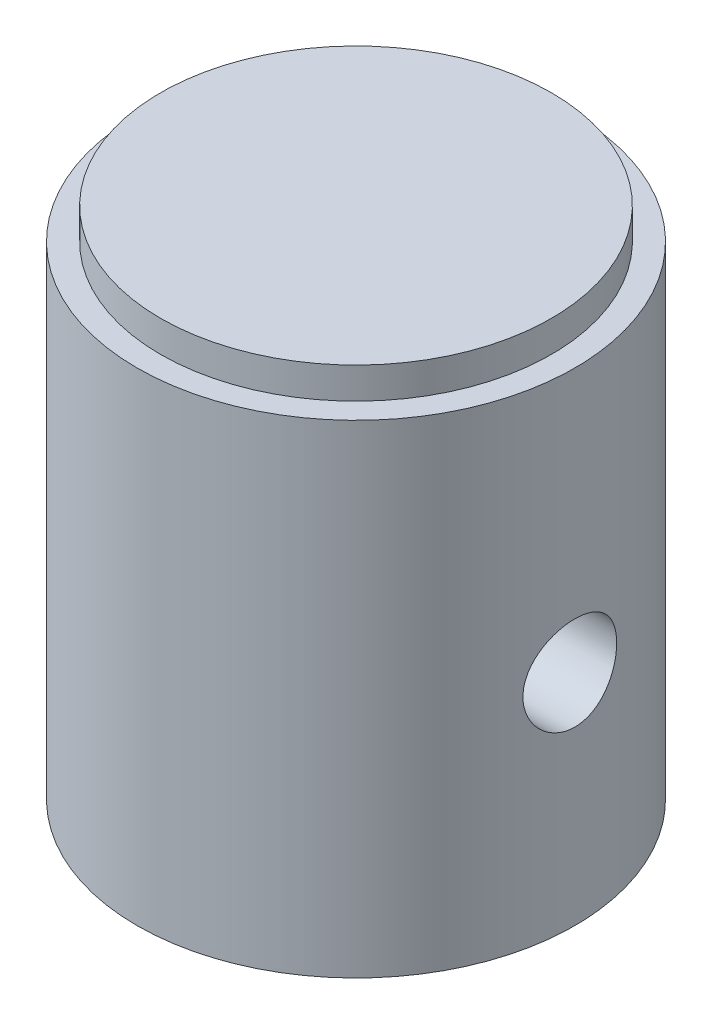
ISO-10303-21;
HEADER;
FILE_DESCRIPTION(('STEP AP214'),'2;1');
FILE_NAME('part.step','',(''),(''),'','','');
FILE_SCHEMA(('AUTOMOTIVE_DESIGN { 1 0 10303 214 1 1 1 1 }'));
ENDSEC;
DATA;
#1=APPLICATION_CONTEXT('core data for automotive mechanical design processes');
#2=APPLICATION_PROTOCOL_DEFINITION('international standard','automotive_design',2000,#1);
#3=PRODUCT_CONTEXT('',#1,'mechanical');
#4=PRODUCT('Part','Part','',(#3));
#5=PRODUCT_RELATED_PRODUCT_CATEGORY('part','',(#4));
#6=PRODUCT_DEFINITION_FORMATION('','',#4);
#7=PRODUCT_DEFINITION_CONTEXT('part definition',#1,'design');
#8=PRODUCT_DEFINITION('design','',#6,#7);
#9=PRODUCT_DEFINITION_SHAPE('','',#8);
#10=(LENGTH_UNIT() NAMED_UNIT(*) SI_UNIT(.MILLI.,.METRE.));
#11=(NAMED_UNIT(*) PLANE_ANGLE_UNIT() SI_UNIT($,.RADIAN.));
#12=(NAMED_UNIT(*) SI_UNIT($,.STERADIAN.) SOLID_ANGLE_UNIT());
#13=UNCERTAINTY_MEASURE_WITH_UNIT(LENGTH_MEASURE(1.E-05),#10,'distance_accuracy_value','');
#14=(GEOMETRIC_REPRESENTATION_CONTEXT(3) GLOBAL_UNCERTAINTY_ASSIGNED_CONTEXT((#13)) GLOBAL_UNIT_ASSIGNED_CONTEXT((#10,
#11,#12)) REPRESENTATION_CONTEXT('',''));
#15=CARTESIAN_POINT('',(0.,0.,0.));
#16=DIRECTION('',(0.,0.,1.));
#17=DIRECTION('',(1.,0.,0.));
#18=AXIS2_PLACEMENT_3D('',#15,#16,#17);
#19=CARTESIAN_POINT('',(0.,0.,0.));
#20=DIRECTION('',(0.,1.,0.));
#21=DIRECTION('',(0.,0.,1.));
#22=AXIS2_PLACEMENT_3D('',#19,#20,#21);
#23=PLANE('',#22);
#24=CARTESIAN_POINT('',(0.,0.,0.));
#25=DIRECTION('',(0.,1.,0.));
#26=DIRECTION('',(0.,0.,1.));
#27=AXIS2_PLACEMENT_3D('',#24,#25,#26);
#28=CIRCLE('',#27,6.25);
#29=CARTESIAN_POINT('',(0.,0.,6.25));
#30=VERTEX_POINT('',#29);
#31=EDGE_CURVE('E11',#30,#30,#28,.T.);
#32=ORIENTED_EDGE('',*,*,#31,.T.);
#33=EDGE_LOOP('',(#32));
#34=FACE_BOUND('',#33,.T.);
#35=ADVANCED_FACE('F43',(#34),#23,.T.);
#36=CARTESIAN_POINT('',(0.,0.,0.));
#37=DIRECTION('',(0.,1.,0.));
#38=DIRECTION('',(0.,0.,1.));
#39=AXIS2_PLACEMENT_3D('',#36,#37,#38);
#40=CYLINDRICAL_SURFACE('',#39,6.25);
#41=CARTESIAN_POINT('',(0.,-1.,0.));
#42=DIRECTION('',(0.,1.,0.));
#43=DIRECTION('',(0.,0.,1.));
#44=AXIS2_PLACEMENT_3D('',#41,#42,#43);
#45=CIRCLE('',#44,6.25);
#46=CARTESIAN_POINT('',(0.,-1.,6.25));
#47=VERTEX_POINT('',#46);
#48=EDGE_CURVE('E56',#47,#47,#45,.T.);
#49=ORIENTED_EDGE('',*,*,#48,.T.);
#50=EDGE_LOOP('',(#49));
#51=FACE_BOUND('',#50,.T.);
#52=ORIENTED_EDGE('',*,*,#31,.F.);
#53=EDGE_LOOP('',(#52));
#54=FACE_BOUND('',#53,.T.);
#55=ADVANCED_FACE('F131',(#51,#54),#40,.T.);
#56=CARTESIAN_POINT('',(-6.25,-1.,0.));
#57=DIRECTION('',(0.,1.,0.));
#58=DIRECTION('',(0.,0.,1.));
#59=AXIS2_PLACEMENT_3D('',#56,#57,#58);
#60=PLANE('',#59);
#61=CARTESIAN_POINT('',(0.,-1.,0.));
#62=DIRECTION('',(0.,1.,0.));
#63=DIRECTION('',(0.,0.,1.));
#64=AXIS2_PLACEMENT_3D('',#61,#62,#63);
#65=CIRCLE('',#64,7.);
#66=CARTESIAN_POINT('',(0.,-1.,7.));
#67=VERTEX_POINT('',#66);
#68=EDGE_CURVE('E95',#67,#67,#65,.T.);
#69=ORIENTED_EDGE('',*,*,#68,.T.);
#70=EDGE_LOOP('',(#69));
#71=FACE_BOUND('',#70,.T.);
#72=ORIENTED_EDGE('',*,*,#48,.F.);
#73=EDGE_LOOP('',(#72));
#74=FACE_BOUND('',#73,.T.);
#75=ADVANCED_FACE('F127',(#71,#74),#60,.T.);
#76=CARTESIAN_POINT('',(0.,0.,0.));
#77=DIRECTION('',(0.,1.,0.));
#78=DIRECTION('',(0.,0.,1.));
#79=AXIS2_PLACEMENT_3D('',#76,#77,#78);
#80=CYLINDRICAL_SURFACE('',#79,7.);
#81=CARTESIAN_POINT('',(-7.,-7.94610214924503,0.));
#82=CARTESIAN_POINT('',(-6.99999846043226,-7.94610504881934,-0.0832358860906165));
#83=CARTESIAN_POINT('',(-6.9985002594971,-7.95305375763289,-0.166507195600274));
#84=CARTESIAN_POINT('',(-6.99266829827727,-7.98063780609863,-0.330687344293327));
#85=CARTESIAN_POINT('',(-6.98833245637099,-8.00128319343997,-0.41159440357119));
#86=CARTESIAN_POINT('',(-6.97730831788826,-8.05558651385307,-0.568649323817737));
#87=CARTESIAN_POINT('',(-6.97062242967171,-8.08923112862635,-0.644801963446556));
#88=CARTESIAN_POINT('',(-6.95562106817971,-8.1685362354163,-0.790378177960787));
#89=CARTESIAN_POINT('',(-6.9473056503666,-8.21419631849498,-0.859801981747369));
#90=CARTESIAN_POINT('',(-6.92981369246311,-8.31698244891854,-0.991024790535229));
#91=CARTESIAN_POINT('',(-6.92062683143259,-8.37425837114356,-1.05270503419445));
#92=CARTESIAN_POINT('',(-6.90250069814144,-8.49832846493023,-1.16566042389435));
#93=CARTESIAN_POINT('',(-6.8935614473163,-8.56512345749629,-1.21693467150908));
#94=CARTESIAN_POINT('',(-6.87684116047225,-8.70720790210547,-1.30814204379808));
#95=CARTESIAN_POINT('',(-6.8690733634436,-8.78257966700124,-1.34794958335009));
#96=CARTESIAN_POINT('',(-6.85572325558537,-8.93913660301187,-1.41428823691148));
#97=CARTESIAN_POINT('',(-6.85014069470711,-9.02032110773761,-1.44082087001716));
#98=CARTESIAN_POINT('',(-6.8418980892631,-9.18491323583311,-1.47946574422454));
#99=CARTESIAN_POINT('',(-6.83919556896486,-9.2682694249089,-1.49178779748342));
#100=CARTESIAN_POINT('',(-6.83689139845106,-9.43590638175203,-1.50231395206577));
#101=CARTESIAN_POINT('',(-6.83728938291729,-9.52018703942498,-1.50051971664629));
#102=CARTESIAN_POINT('',(-6.84110276603832,-9.68572683717883,-1.48303326340861));
#103=CARTESIAN_POINT('',(-6.84446541682162,-9.76701303834519,-1.46758398649408));
#104=CARTESIAN_POINT('',(-6.85374593375788,-9.92581238953438,-1.42361054298677));
#105=CARTESIAN_POINT('',(-6.85966393808402,-10.0033253352774,-1.39508566936466));
#106=CARTESIAN_POINT('',(-6.87344080755724,-10.1530650221184,-1.32554551075991));
#107=CARTESIAN_POINT('',(-6.88131420983365,-10.2252466619576,-1.2844361097283));
#108=CARTESIAN_POINT('',(-6.89810572501288,-10.361777314203,-1.19096007283993));
#109=CARTESIAN_POINT('',(-6.90702397481896,-10.4261252979312,-1.13859196103562));
#110=CARTESIAN_POINT('',(-6.92512718393878,-10.5465615049184,-1.0227954275532));
#111=CARTESIAN_POINT('',(-6.93431383972177,-10.6024508558298,-0.959160233964412));
#112=CARTESIAN_POINT('',(-6.95175017497059,-10.7027958829347,-0.823317306269098));
#113=CARTESIAN_POINT('',(-6.95999983875972,-10.7472513678454,-0.751109428775401));
#114=CARTESIAN_POINT('',(-6.97465778534003,-10.823512829152,-0.59993346204996));
#115=CARTESIAN_POINT('',(-6.98106238643354,-10.855293561823,-0.520952258863484));
#116=CARTESIAN_POINT('',(-6.99128109245334,-10.9050777975661,-0.358603146685707));
#117=CARTESIAN_POINT('',(-6.99509555860384,-10.9230832218083,-0.27523585113367));
#118=CARTESIAN_POINT('',(-6.99965306347808,-10.9445183633885,-0.10818767083663));
#119=CARTESIAN_POINT('',(-7.00045336521066,-10.9482198621268,-0.0245431772716159));
#120=CARTESIAN_POINT('',(-6.99905248935969,-10.9416775781199,0.142168973650404));
#121=CARTESIAN_POINT('',(-6.99685150675698,-10.9314347012821,0.225236668127254));
#122=CARTESIAN_POINT('',(-6.98973143045266,-10.8975199055833,0.387542537982805));
#123=CARTESIAN_POINT('',(-6.98484105045459,-10.8739897797725,0.466811712908477));
#124=CARTESIAN_POINT('',(-6.9728892442151,-10.8143252062502,0.620278450473417));
#125=CARTESIAN_POINT('',(-6.96582763822237,-10.7781897149334,0.694475592587739));
#126=CARTESIAN_POINT('',(-6.950175043904,-10.6937686061847,0.836821397964753));
#127=CARTESIAN_POINT('',(-6.94156431354275,-10.6453223543353,0.90487257511114));
#128=CARTESIAN_POINT('',(-6.92381033034847,-10.5378673243563,1.0319769255236));
#129=CARTESIAN_POINT('',(-6.91466701142097,-10.4788572333576,1.091028978692));
#130=CARTESIAN_POINT('',(-6.89668172706324,-10.3507047790579,1.19952711057989));
#131=CARTESIAN_POINT('',(-6.88784792221285,-10.2814020500229,1.24878537255157));
#132=CARTESIAN_POINT('',(-6.87166654559681,-10.135347552767,1.3349641538604));
#133=CARTESIAN_POINT('',(-6.86431891048055,-10.0585961022675,1.37188519913706));
#134=CARTESIAN_POINT('',(-6.8520100980739,-9.90022985025043,1.43209741248548));
#135=CARTESIAN_POINT('',(-6.84703574582967,-9.81864479281437,1.45546398641275));
#136=CARTESIAN_POINT('',(-6.84001186708418,-9.6525865654114,1.48812696085335));
#137=CARTESIAN_POINT('',(-6.83796189439706,-9.56811383804371,1.49742550780258));
#138=CARTESIAN_POINT('',(-6.83704618848155,-9.40056980606979,1.5015999992604));
#139=CARTESIAN_POINT('',(-6.83811476518543,-9.31750613426446,1.49677347258311));
#140=CARTESIAN_POINT('',(-6.8431676318483,-9.15340490711245,1.47349789406331));
#141=CARTESIAN_POINT('',(-6.84715189026714,-9.07236732985846,1.45504898957979));
#142=CARTESIAN_POINT('',(-6.85755581104157,-8.91484349137587,1.40519345940434));
#143=CARTESIAN_POINT('',(-6.86396764224703,-8.83834350058074,1.37382847170887));
#144=CARTESIAN_POINT('',(-6.87850764590649,-8.69164677673819,1.29906751595601));
#145=CARTESIAN_POINT('',(-6.88663598880362,-8.62145067062999,1.255670353015));
#146=CARTESIAN_POINT('',(-6.90389055593232,-8.48788395551967,1.15708290349304));
#147=CARTESIAN_POINT('',(-6.91303309938926,-8.42467245329806,1.10167987421237));
#148=CARTESIAN_POINT('',(-6.93117449799694,-8.30834588672458,0.981086554619622));
#149=CARTESIAN_POINT('',(-6.94017331951296,-8.25523315493283,0.915894009385597));
#150=CARTESIAN_POINT('',(-6.95714491048987,-8.15998618973947,0.776603147268717));
#151=CARTESIAN_POINT('',(-6.96510364570626,-8.11799554301406,0.702404846009641));
#152=CARTESIAN_POINT('',(-6.97895826104019,-8.04714762033885,0.547850160940599));
#153=CARTESIAN_POINT('',(-6.98485590212343,-8.01827912666,0.46749910586388));
#154=CARTESIAN_POINT('',(-6.99284848461772,-7.97974996411389,0.322535217553205));
#155=CARTESIAN_POINT('',(-6.99551391888263,-7.967155715265,0.25871720554598));
#156=CARTESIAN_POINT('',(-6.99909024154719,-7.95033084753337,0.129939960853847));
#157=CARTESIAN_POINT('',(-7.00000120191314,-7.94609988559897,0.0649807750887452));
#158=CARTESIAN_POINT('',(-7.,-7.94610214924503,0.));
#159=B_SPLINE_CURVE_WITH_KNOTS('',3,(#81,#82,#83,#84,#85,#86,#87,#88,#89,#90,#91,#92,#93,#94,
#95,#96,#97,#98,#99,#100,#101,#102,#103,#104,#105,#106,#107,#108,#109,#110,#111,#112,#113,#114,
#115,#116,#117,#118,#119,#120,#121,#122,#123,#124,#125,#126,#127,#128,#129,#130,#131,#132,#133,
#134,#135,#136,#137,#138,#139,#140,#141,#142,#143,#144,#145,#146,#147,#148,#149,#150,#151,#152,
#153,#154,#155,#156,#157,#158),.UNSPECIFIED.,.T.,.F.,(4,2,2,2,2,2,2,2,2,2,2,2,2,2,2,2,2,2,2,2,2,
2,2,2,2,2,2,2,2,2,2,2,2,2,2,2,2,2,4),(0.,0.249469836512082,0.499122883219935,0.748520824425602,
0.997910278645886,1.25074961881732,1.50361077918506,1.7591442921451,2.0146485567749,
2.26633008124666,2.51798195169165,2.76524475452928,3.01252092904568,3.26169356165968,
3.51089887920889,3.76527011050291,4.0196455970235,4.27452521139806,4.52936927256343,
4.77934665704185,5.02930780231429,5.27665060589267,5.52401389198434,5.77478733867803,
6.02559197304485,6.28082063283534,6.53603841075806,6.78982240408475,7.04356767229185,
7.29200680540294,7.5404432510827,7.78808499706785,8.03575134451623,8.28822950154114,
8.54076590397115,8.79641910357222,9.05185334010271,9.24661799132294,9.44137465337336),.UNSPECIFIED.);
#160=CARTESIAN_POINT('',(-7.,-7.94610214924503,0.));
#161=VERTEX_POINT('',#160);
#162=EDGE_CURVE('E72',#161,#161,#159,.T.);
#163=ORIENTED_EDGE('',*,*,#162,.F.);
#164=EDGE_LOOP('',(#163));
#165=FACE_BOUND('',#164,.T.);
#166=CARTESIAN_POINT('',(6.83739716558867,-9.44610214924503,-1.5));
#167=CARTESIAN_POINT('',(6.83739884558951,-9.36289099676308,-1.49999708238613));
#168=CARTESIAN_POINT('',(6.83893272341929,-9.27964437530291,-1.49305236244768));
#169=CARTESIAN_POINT('',(6.84489178429867,-9.11551547700303,-1.46548559252999));
#170=CARTESIAN_POINT('',(6.84931911211841,-9.03463500056883,-1.44485339653622));
#171=CARTESIAN_POINT('',(6.86054115293409,-8.87763639967083,-1.39058863684599));
#172=CARTESIAN_POINT('',(6.86733332725825,-8.80151327112357,-1.35697000991314));
#173=CARTESIAN_POINT('',(6.88251670848644,-8.65598687530042,-1.27772617673341));
#174=CARTESIAN_POINT('',(6.89090786877545,-8.58658341221596,-1.23210132048776));
#175=CARTESIAN_POINT('',(6.90849578796654,-8.45533918776291,-1.12935142570221));
#176=CARTESIAN_POINT('',(6.91770249871753,-8.39362327300507,-1.07206859483983));
#177=CARTESIAN_POINT('',(6.93579691710397,-8.28059859483925,-0.947969508129577));
#178=CARTESIAN_POINT('',(6.94468460051416,-8.22929062038497,-0.881152530217675));
#179=CARTESIAN_POINT('',(6.96124769109432,-8.1380467047536,-0.739047288464581));
#180=CARTESIAN_POINT('',(6.96890998819429,-8.09823049347442,-0.663680488229954));
#181=CARTESIAN_POINT('',(6.98204671042933,-8.03187445779874,-0.507134269342596));
#182=CARTESIAN_POINT('',(6.98752137103329,-8.00533320445876,-0.425955477380312));
#183=CARTESIAN_POINT('',(6.9955956528118,-7.96667217831369,-0.261387187671512));
#184=CARTESIAN_POINT('',(6.99823733378385,-7.9543412206926,-0.178049400596924));
#185=CARTESIAN_POINT('',(7.00049362207002,-7.94379087193178,-0.0104489453066451));
#186=CARTESIAN_POINT('',(7.00010856232698,-7.94556992868428,0.073813620164759));
#187=CARTESIAN_POINT('',(6.99638700862558,-7.96303111390862,0.239417029250512));
#188=CARTESIAN_POINT('',(6.99309883152432,-7.97848564953496,0.320783115362112));
#189=CARTESIAN_POINT('',(6.98399541589104,-8.0224968310969,0.479739463978389));
#190=CARTESIAN_POINT('',(6.97818006616518,-8.05105405354477,0.557329560175054));
#191=CARTESIAN_POINT('',(6.96459754646858,-8.12066360813355,0.707167497556553));
#192=CARTESIAN_POINT('',(6.95681685803946,-8.16180291644938,0.779373657015788));
#193=CARTESIAN_POINT('',(6.94015793743865,-8.25534411740863,0.915940926562846));
#194=CARTESIAN_POINT('',(6.93127956144693,-8.30774748654534,0.980301006451528));
#195=CARTESIAN_POINT('',(6.91319326460925,-8.4235706937729,1.10070208800198));
#196=CARTESIAN_POINT('',(6.90398230372853,-8.48718972860207,1.1565511732025));
#197=CARTESIAN_POINT('',(6.88643566831974,-8.62298543431354,1.25682243234728));
#198=CARTESIAN_POINT('',(6.87810001563386,-8.69516231865028,1.30124432118068));
#199=CARTESIAN_POINT('',(6.86324023586723,-8.84632665030879,1.37748077573296));
#200=CARTESIAN_POINT('',(6.85672115127775,-8.92533227309747,1.40926035088923));
#201=CARTESIAN_POINT('',(6.84630340806616,-9.08773491519147,1.45903495159115));
#202=CARTESIAN_POINT('',(6.84240435218483,-9.17113126668822,1.47703206694628));
#203=CARTESIAN_POINT('',(6.83774881255446,-9.33819790189475,1.49843586024652));
#204=CARTESIAN_POINT('',(6.83693227051701,-9.42183082432234,1.5021214192864));
#205=CARTESIAN_POINT('',(6.83837239573993,-9.58851614242673,1.49555139642373));
#206=CARTESIAN_POINT('',(6.84062886101063,-9.67156857589858,1.48529673081635));
#207=CARTESIAN_POINT('',(6.84790415484205,-9.8337725842258,1.45137894635584));
#208=CARTESIAN_POINT('',(6.85289155274364,-9.91295758184199,1.42786830251553));
#209=CARTESIAN_POINT('',(6.86503859869777,-10.066264486778,1.3682705294675));
#210=CARTESIAN_POINT('',(6.87219844772849,-10.1403859248792,1.33218223662818));
#211=CARTESIAN_POINT('',(6.88801634080345,-10.282671834004,1.24783504416705));
#212=CARTESIAN_POINT('',(6.89669501746317,-10.3507317312572,1.19940368590792));
#213=CARTESIAN_POINT('',(6.91451775360139,-10.4778604951188,1.09197183833601));
#214=CARTESIAN_POINT('',(6.92366186834461,-10.5369282906935,1.03297009182161));
#215=CARTESIAN_POINT('',(6.94158239990173,-10.6454724521898,0.904812764420815));
#216=CARTESIAN_POINT('',(6.95034935607746,-10.694759065402,0.835494925828771));
#217=CARTESIAN_POINT('',(6.96635610714901,-10.7809875585961,0.689401481282276));
#218=CARTESIAN_POINT('',(6.97359597176692,-10.8179300022179,0.612626216043739));
#219=CARTESIAN_POINT('',(6.98569278381574,-10.8781542038835,0.45426541898204));
#220=CARTESIAN_POINT('',(6.99056443803698,-10.9015204529913,0.372713193075172));
#221=CARTESIAN_POINT('',(6.9974393930198,-10.9341938549774,0.206725177003289));
#222=CARTESIAN_POINT('',(6.99944309312296,-10.9435029652189,0.122289789973994));
#223=CARTESIAN_POINT('',(7.00034511009056,-10.9477128016569,-0.0452637170528279));
#224=CARTESIAN_POINT('',(6.99930459001667,-10.9428973078497,-0.128374505509228));
#225=CARTESIAN_POINT('',(6.99436552363383,-10.919627385726,-0.29257293841596));
#226=CARTESIAN_POINT('',(6.99046702473686,-10.9011731836667,-0.373660616405284));
#227=CARTESIAN_POINT('',(6.98025388638537,-10.8512833429955,-0.531301948487268));
#228=CARTESIAN_POINT('',(6.97394646430492,-10.8198864598595,-0.607868365073176));
#229=CARTESIAN_POINT('',(6.95959036050661,-10.7450408780759,-0.754684956723219));
#230=CARTESIAN_POINT('',(6.9515415172034,-10.701591060939,-0.82493454479614));
#231=CARTESIAN_POINT('',(6.93439809934493,-10.6029398305024,-0.958512306895242));
#232=CARTESIAN_POINT('',(6.92528708907874,-10.5475379909237,-1.02169036510577));
#233=CARTESIAN_POINT('',(6.90713690075836,-10.4269615389947,-1.13795001457642));
#234=CARTESIAN_POINT('',(6.89809774045682,-10.3617845858894,-1.19102918062422));
#235=CARTESIAN_POINT('',(6.88098693651915,-10.2225116560594,-1.28623261596675));
#236=CARTESIAN_POINT('',(6.87292905956533,-10.148312790958,-1.32820897809616));
#237=CARTESIAN_POINT('',(6.85886497228049,-9.99375842832179,-1.39903004659825));
#238=CARTESIAN_POINT('',(6.85285699581573,-9.91340830399197,-1.42788606423931));
#239=CARTESIAN_POINT('',(6.84470560641996,-9.76847601805918,-1.46638607121557));
#240=CARTESIAN_POINT('',(6.84198283087953,-9.70469047353721,-1.47896752507743));
#241=CARTESIAN_POINT('',(6.83832799504405,-9.57597783766771,-1.49577544043437));
#242=CARTESIAN_POINT('',(6.83739585430069,-9.51105079773672,-1.50000227727981));
#243=CARTESIAN_POINT('',(6.83739716558867,-9.44610214924503,-1.5));
#244=B_SPLINE_CURVE_WITH_KNOTS('',3,(#166,#167,#168,#169,#170,#171,#172,#173,#174,#175,#176,
#177,#178,#179,#180,#181,#182,#183,#184,#185,#186,#187,#188,#189,#190,#191,#192,#193,#194,#195,
#196,#197,#198,#199,#200,#201,#202,#203,#204,#205,#206,#207,#208,#209,#210,#211,#212,#213,#214,
#215,#216,#217,#218,#219,#220,#221,#222,#223,#224,#225,#226,#227,#228,#229,#230,#231,#232,#233,
#234,#235,#236,#237,#238,#239,#240,#241,#242,#243),.UNSPECIFIED.,.T.,.F.,(4,2,2,2,2,2,2,2,2,2,2,
2,2,2,2,2,2,2,2,2,2,2,2,2,2,2,2,2,2,2,2,2,2,2,2,2,2,2,4),(0.,0.249395482027529,
0.498976038479964,0.748289491152758,0.997595676735284,1.25053229582692,1.50348808112879,
1.75899134820278,2.01446710646267,2.26609508151929,2.51769537777241,2.76518557667371,
3.01268666607584,3.26193888143437,3.51122378872315,3.76548960779295,4.01976177023092,
4.27473287411781,4.52966530953839,4.77960433192522,5.02952692653916,5.27663180749375,
5.5237595556315,5.77455010216318,6.02537049659078,6.2806621468321,6.53594213875541,
6.78961589824375,7.04325433208539,7.29183199644126,7.54040553715099,7.78824009619483,
8.03609766151365,8.28848914160964,8.54094115631232,8.79660380167248,9.05204561611687,
9.24671456122272,9.44137476018022),.UNSPECIFIED.);
#245=CARTESIAN_POINT('',(6.83739716558867,-9.44610214924503,-1.5));
#246=VERTEX_POINT('',#245);
#247=EDGE_CURVE('E80',#246,#246,#244,.T.);
#248=ORIENTED_EDGE('',*,*,#247,.F.);
#249=EDGE_LOOP('',(#248));
#250=FACE_BOUND('',#249,.T.);
#251=CARTESIAN_POINT('',(0.,-16.446102149245,0.));
#252=DIRECTION('',(0.,1.,0.));
#253=DIRECTION('',(0.,0.,1.));
#254=AXIS2_PLACEMENT_3D('',#251,#252,#253);
#255=CIRCLE('',#254,7.);
#256=CARTESIAN_POINT('',(0.,-16.446102149245,7.));
#257=VERTEX_POINT('',#256);
#258=EDGE_CURVE('E91',#257,#257,#255,.T.);
#259=ORIENTED_EDGE('',*,*,#258,.T.);
#260=EDGE_LOOP('',(#259));
#261=FACE_BOUND('',#260,.T.);
#262=ORIENTED_EDGE('',*,*,#68,.F.);
#263=EDGE_LOOP('',(#262));
#264=FACE_BOUND('',#263,.T.);
#265=ADVANCED_FACE('F121',(#165,#250,#261,#264),#80,.T.);
#266=CARTESIAN_POINT('',(-7.,-16.446102149245,0.));
#267=DIRECTION('',(0.,-1.,0.));
#268=DIRECTION('',(0.,0.,-1.));
#269=AXIS2_PLACEMENT_3D('',#266,#267,#268);
#270=PLANE('',#269);
#271=CARTESIAN_POINT('',(0.,-16.446102149245,0.));
#272=DIRECTION('',(0.,1.,0.));
#273=DIRECTION('',(0.,0.,1.));
#274=AXIS2_PLACEMENT_3D('',#271,#272,#273);
#275=CIRCLE('',#274,6.2);
#276=CARTESIAN_POINT('',(0.,-16.446102149245,6.2));
#277=VERTEX_POINT('',#276);
#278=EDGE_CURVE('E77',#277,#277,#275,.T.);
#279=ORIENTED_EDGE('',*,*,#278,.T.);
#280=EDGE_LOOP('',(#279));
#281=FACE_BOUND('',#280,.T.);
#282=ORIENTED_EDGE('',*,*,#258,.F.);
#283=EDGE_LOOP('',(#282));
#284=FACE_BOUND('',#283,.T.);
#285=ADVANCED_FACE('F126',(#281,#284),#270,.T.);
#286=CARTESIAN_POINT('',(0.,-16.446102149245,0.));
#287=DIRECTION('',(0.,-1.,0.));
#288=DIRECTION('',(0.,0.,-1.));
#289=AXIS2_PLACEMENT_3D('',#286,#287,#288);
#290=CONICAL_SURFACE('',#289,6.2,0.349065850398867);
#291=CARTESIAN_POINT('',(0.,-11.0885211813085,0.));
#292=DIRECTION('',(0.,1.,0.));
#293=DIRECTION('',(0.,0.,1.));
#294=AXIS2_PLACEMENT_3D('',#291,#292,#293);
#295=CIRCLE('',#294,4.25);
#296=CARTESIAN_POINT('',(0.,-11.0885211813085,4.25));
#297=VERTEX_POINT('',#296);
#298=EDGE_CURVE('E71',#297,#297,#295,.T.);
#299=ORIENTED_EDGE('',*,*,#298,.T.);
#300=EDGE_LOOP('',(#299));
#301=FACE_BOUND('',#300,.T.);
#302=ORIENTED_EDGE('',*,*,#278,.F.);
#303=EDGE_LOOP('',(#302));
#304=FACE_BOUND('',#303,.T.);
#305=ADVANCED_FACE('F168',(#301,#304),#290,.F.);
#306=CARTESIAN_POINT('',(0.,0.,0.));
#307=DIRECTION('',(0.,1.,0.));
#308=DIRECTION('',(0.,0.,1.));
#309=AXIS2_PLACEMENT_3D('',#306,#307,#308);
#310=CYLINDRICAL_SURFACE('',#309,4.25);
#311=CARTESIAN_POINT('',(-3.97649343014672,-9.44610214924503,-1.5));
#312=CARTESIAN_POINT('',(-3.97649214909622,-9.36471567502817,-1.50000149066614));
#313=CARTESIAN_POINT('',(-3.97901926460663,-9.28333956531805,-1.4933539928128));
#314=CARTESIAN_POINT('',(-3.98879393121351,-9.12301792184182,-1.467043425783));
#315=CARTESIAN_POINT('',(-3.99604180849163,-9.04407255642308,-1.44737945723028));
#316=CARTESIAN_POINT('',(-4.01433694093499,-8.89096525375563,-1.39582864763434));
#317=CARTESIAN_POINT('',(-4.02537600242113,-8.81679340690745,-1.3639681493962));
#318=CARTESIAN_POINT('',(-4.04999718693604,-8.67482096208123,-1.28902032615882));
#319=CARTESIAN_POINT('',(-4.06357997084496,-8.60702202672918,-1.24593008243685));
#320=CARTESIAN_POINT('',(-4.09242710764337,-8.47674148225748,-1.14771819298727));
#321=CARTESIAN_POINT('',(-4.10773694032568,-8.41458013477823,-1.09218496328606));
#322=CARTESIAN_POINT('',(-4.13793108703667,-8.30023094713523,-0.971539529215814));
#323=CARTESIAN_POINT('',(-4.15281532257706,-8.24804493665496,-0.906425571411499));
#324=CARTESIAN_POINT('',(-4.18101417320175,-8.15363410063344,-0.766084463279065));
#325=CARTESIAN_POINT('',(-4.1942691509212,-8.1117505716095,-0.690614666665437));
#326=CARTESIAN_POINT('',(-4.21717524967502,-8.04140336244221,-0.53315128512888));
#327=CARTESIAN_POINT('',(-4.22682746779622,-8.0129355963313,-0.45115969541723));
#328=CARTESIAN_POINT('',(-4.24111806230583,-7.97133094139418,-0.286342304623607));
#329=CARTESIAN_POINT('',(-4.24593576097444,-7.95764417532979,-0.203671152754864));
#330=CARTESIAN_POINT('',(-4.25065423277204,-7.94423547188559,-0.0370745275961797));
#331=CARTESIAN_POINT('',(-4.25055642363378,-7.94450950792591,0.0468505770469167));
#332=CARTESIAN_POINT('',(-4.24557303368344,-7.95867885796368,0.209658331252813));
#333=CARTESIAN_POINT('',(-4.24089784006484,-7.97197562558538,0.2886005957657));
#334=CARTESIAN_POINT('',(-4.22755452510655,-8.01081542272743,0.443051329641929));
#335=CARTESIAN_POINT('',(-4.21888612615129,-8.03635930369646,0.518559559863311));
#336=CARTESIAN_POINT('',(-4.1982765292198,-8.09928423065046,0.66523688409227));
#337=CARTESIAN_POINT('',(-4.18629157029728,-8.1368246718638,0.736331194343441));
#338=CARTESIAN_POINT('',(-4.16028068330645,-8.22254161709929,0.871378860385227));
#339=CARTESIAN_POINT('',(-4.14625414290583,-8.27072131440768,0.935330063534182));
#340=CARTESIAN_POINT('',(-4.11675686574673,-8.37930600406931,1.05782314621004));
#341=CARTESIAN_POINT('',(-4.10124896585007,-8.44021909619296,1.11590634661617));
#342=CARTESIAN_POINT('',(-4.07114153369187,-8.57103691101814,1.22119303639003));
#343=CARTESIAN_POINT('',(-4.05654217937968,-8.64094338700709,1.26839439928753));
#344=CARTESIAN_POINT('',(-4.02968687866734,-8.78937800976164,1.35131941506838));
#345=CARTESIAN_POINT('',(-4.01747692094867,-8.86803672264467,1.38682541655623));
#346=CARTESIAN_POINT('',(-3.99731320881638,-9.03075889147824,1.44392345851287));
#347=CARTESIAN_POINT('',(-3.98935740819943,-9.11481972723181,1.46552218925019));
#348=CARTESIAN_POINT('',(-3.97907468667611,-9.28147311153128,1.49320901940327));
#349=CARTESIAN_POINT('',(-3.97648696082043,-9.36392999594736,1.50001658316877));
#350=CARTESIAN_POINT('',(-3.97649991880842,-9.52883074720956,1.49998336545342));
#351=CARTESIAN_POINT('',(-3.97909950750846,-9.6112746131292,1.49314546479712));
#352=CARTESIAN_POINT('',(-3.98893187176901,-9.77035130138137,1.46666482624805));
#353=CARTESIAN_POINT('',(-3.99597453330859,-9.84708455226245,1.44754695230617));
#354=CARTESIAN_POINT('',(-4.01368284140357,-9.99623028428617,1.39769271168344));
#355=CARTESIAN_POINT('',(-4.02434917747314,-10.0686419400288,1.36695413368494));
#356=CARTESIAN_POINT('',(-4.04855743284535,-10.2098621789297,1.29353081699443));
#357=CARTESIAN_POINT('',(-4.06218587357297,-10.278460230288,1.25047047913953));
#358=CARTESIAN_POINT('',(-4.09062543004624,-10.4077151263744,1.15403941792046));
#359=CARTESIAN_POINT('',(-4.10543693318759,-10.4683693525802,1.10066530910848));
#360=CARTESIAN_POINT('',(-4.13555823449249,-10.5834670130488,0.981643183024892));
#361=CARTESIAN_POINT('',(-4.15085066581211,-10.6373857362024,0.915481737190288));
#362=CARTESIAN_POINT('',(-4.17941819461262,-10.7334026916941,0.774672313060189));
#363=CARTESIAN_POINT('',(-4.19269333373818,-10.7755011680625,0.700024510011325));
#364=CARTESIAN_POINT('',(-4.21568899106777,-10.8463355801279,0.544606737072459));
#365=CARTESIAN_POINT('',(-4.22542849340978,-10.8751431130336,0.463872361931828));
#366=CARTESIAN_POINT('',(-4.24033266974149,-10.9186318058707,0.298287687197164));
#367=CARTESIAN_POINT('',(-4.24549921973347,-10.9333187588246,0.213439090498386));
#368=CARTESIAN_POINT('',(-4.25051699917857,-10.9475795683292,0.0468065677420786));
#369=CARTESIAN_POINT('',(-4.25063178196184,-10.947902796896,-0.0349059269684598));
#370=CARTESIAN_POINT('',(-4.24619950663751,-10.9353116899353,-0.197167452676124));
#371=CARTESIAN_POINT('',(-4.2416529069009,-10.9223986559784,-0.277716597280001));
#372=CARTESIAN_POINT('',(-4.2285169330624,-10.8842142290494,-0.433778286670082));
#373=CARTESIAN_POINT('',(-4.22000848234695,-10.8591898328044,-0.509358577607373));
#374=CARTESIAN_POINT('',(-4.19982799144413,-10.7977289615681,-0.655267438550125));
#375=CARTESIAN_POINT('',(-4.18815536109295,-10.7612903574697,-0.72559502572846));
#376=CARTESIAN_POINT('',(-4.16225918540311,-10.6763854742214,-0.862039823344103));
#377=CARTESIAN_POINT('',(-4.14795303334485,-10.6275006305383,-0.927880648538293));
#378=CARTESIAN_POINT('',(-4.11856748977774,-10.5197782913195,-1.05066387857035));
#379=CARTESIAN_POINT('',(-4.10348783821095,-10.4609374329891,-1.10760326426854));
#380=CARTESIAN_POINT('',(-4.0734305107236,-10.3317933092716,-1.21360605190335));
#381=CARTESIAN_POINT('',(-4.05848841916547,-10.2610914598158,-1.26219564892133));
#382=CARTESIAN_POINT('',(-4.03120773916043,-10.1120530589218,-1.34679190655785));
#383=CARTESIAN_POINT('',(-4.01886887914683,-10.0337173050928,-1.38279987993703));
#384=CARTESIAN_POINT('',(-3.99842733874428,-9.87191628118393,-1.4408433857428));
#385=CARTESIAN_POINT('',(-3.99030435945452,-9.78847779439976,-1.46294598203452));
#386=CARTESIAN_POINT('',(-3.97933932582699,-9.61872212126445,-1.49252005925822));
#387=CARTESIAN_POINT('',(-3.97649478860321,-9.53240630781732,-1.49999841926206));
#388=CARTESIAN_POINT('',(-3.97649343014672,-9.44610214924503,-1.5));
#389=B_SPLINE_CURVE_WITH_KNOTS('',3,(#311,#312,#313,#314,#315,#316,#317,#318,#319,#320,#321,
#322,#323,#324,#325,#326,#327,#328,#329,#330,#331,#332,#333,#334,#335,#336,#337,#338,#339,#340,
#341,#342,#343,#344,#345,#346,#347,#348,#349,#350,#351,#352,#353,#354,#355,#356,#357,#358,#359,
#360,#361,#362,#363,#364,#365,#366,#367,#368,#369,#370,#371,#372,#373,#374,#375,#376,#377,#378,
#379,#380,#381,#382,#383,#384,#385,#386,#387,#388),.UNSPECIFIED.,.T.,.F.,(4,2,2,2,2,2,2,2,2,2,2,
2,2,2,2,2,2,2,2,2,2,2,2,2,2,2,2,2,2,2,2,2,2,2,2,2,2,2,4),(0.,0.243839006544291,
0.487694862963852,0.731026969563558,0.974422383786307,1.22753298971473,1.48068997691713,
1.74135441615622,2.0019394148239,2.25245548997849,2.5028993116002,2.74234783916106,
2.98181301617189,3.22460232531388,3.46746460497961,3.72304556602678,3.97867642907767,
4.2388262851451,4.49885089914735,4.74591459605723,4.9929261385042,5.23002521944513,
5.46716944098184,5.7124961811414,5.95790358588542,6.21680151100199,6.47569409074483,
6.73317526869982,6.99055076887334,7.23448201895284,7.47838928467027,7.71751952828777,
7.95669440376865,8.20532517639425,8.45404009608482,8.71402519995543,8.97398316899732,
9.23267758399595,9.49125028283081),.UNSPECIFIED.);
#390=CARTESIAN_POINT('',(-3.97649343014672,-9.44610214924503,-1.5));
#391=VERTEX_POINT('',#390);
#392=EDGE_CURVE('E46',#391,#391,#389,.T.);
#393=ORIENTED_EDGE('',*,*,#392,.F.);
#394=EDGE_LOOP('',(#393));
#395=FACE_BOUND('',#394,.T.);
#396=CARTESIAN_POINT('',(3.97649343014672,-9.44610214924503,-1.5));
#397=CARTESIAN_POINT('',(3.97649214909622,-9.52748862346189,-1.50000149066614));
#398=CARTESIAN_POINT('',(3.97901926460663,-9.60886473317202,-1.4933539928128));
#399=CARTESIAN_POINT('',(3.98879393121351,-9.76918637664825,-1.467043425783));
#400=CARTESIAN_POINT('',(3.99604180849163,-9.84813174206699,-1.44737945723028));
#401=CARTESIAN_POINT('',(4.01433694093499,-10.0012390447344,-1.39582864763434));
#402=CARTESIAN_POINT('',(4.02537600242113,-10.0754108915826,-1.3639681493962));
#403=CARTESIAN_POINT('',(4.04999718693604,-10.2173833364088,-1.28902032615882));
#404=CARTESIAN_POINT('',(4.06357997084496,-10.2851822717609,-1.24593008243685));
#405=CARTESIAN_POINT('',(4.09242710764337,-10.4154628162326,-1.14771819298727));
#406=CARTESIAN_POINT('',(4.10773694032568,-10.4776241637118,-1.09218496328606));
#407=CARTESIAN_POINT('',(4.13793108703667,-10.5919733513548,-0.971539529215814));
#408=CARTESIAN_POINT('',(4.15281532257706,-10.6441593618351,-0.906425571411499));
#409=CARTESIAN_POINT('',(4.18101417320175,-10.7385701978566,-0.766084463279065));
#410=CARTESIAN_POINT('',(4.1942691509212,-10.7804537268806,-0.690614666665437));
#411=CARTESIAN_POINT('',(4.21717524967502,-10.8508009360479,-0.53315128512888));
#412=CARTESIAN_POINT('',(4.22682746779622,-10.8792687021588,-0.45115969541723));
#413=CARTESIAN_POINT('',(4.24111806230583,-10.9208733570959,-0.286342304623607));
#414=CARTESIAN_POINT('',(4.24593576097444,-10.9345601231603,-0.203671152754864));
#415=CARTESIAN_POINT('',(4.25065423277204,-10.9479688266045,-0.0370745275961797));
#416=CARTESIAN_POINT('',(4.25055642363378,-10.9476947905642,0.0468505770469167));
#417=CARTESIAN_POINT('',(4.24557303368344,-10.9335254405264,0.209658331252813));
#418=CARTESIAN_POINT('',(4.24089784006484,-10.9202286729047,0.2886005957657));
#419=CARTESIAN_POINT('',(4.22755452510655,-10.8813888757626,0.443051329641929));
#420=CARTESIAN_POINT('',(4.21888612615129,-10.8558449947936,0.518559559863311));
#421=CARTESIAN_POINT('',(4.1982765292198,-10.7929200678396,0.66523688409227));
#422=CARTESIAN_POINT('',(4.18629157029728,-10.7553796266263,0.736331194343441));
#423=CARTESIAN_POINT('',(4.16028068330645,-10.6696626813908,0.871378860385227));
#424=CARTESIAN_POINT('',(4.14625414290583,-10.6214829840824,0.935330063534182));
#425=CARTESIAN_POINT('',(4.11675686574673,-10.5128982944208,1.05782314621004));
#426=CARTESIAN_POINT('',(4.10124896585006,-10.4519852022971,1.11590634661617));
#427=CARTESIAN_POINT('',(4.07114153369187,-10.3211673874719,1.22119303639003));
#428=CARTESIAN_POINT('',(4.05654217937968,-10.251260911483,1.26839439928753));
#429=CARTESIAN_POINT('',(4.02968687866734,-10.1028262887284,1.35131941506838));
#430=CARTESIAN_POINT('',(4.01747692094867,-10.0241675758454,1.38682541655623));
#431=CARTESIAN_POINT('',(3.99731320881638,-9.86144540701184,1.44392345851287));
#432=CARTESIAN_POINT('',(3.98935740819943,-9.77738457125827,1.46552218925019));
#433=CARTESIAN_POINT('',(3.97907468667611,-9.61073118695879,1.49320901940327));
#434=CARTESIAN_POINT('',(3.97648696082043,-9.5282743025427,1.50001658316877));
#435=CARTESIAN_POINT('',(3.97649991880842,-9.36337355128051,1.49998336545342));
#436=CARTESIAN_POINT('',(3.97909950750846,-9.28092968536086,1.49314546479712));
#437=CARTESIAN_POINT('',(3.98893187176901,-9.1218529971087,1.46666482624805));
#438=CARTESIAN_POINT('',(3.99597453330859,-9.04511974622761,1.44754695230617));
#439=CARTESIAN_POINT('',(4.01368284140357,-8.89597401420389,1.39769271168344));
#440=CARTESIAN_POINT('',(4.02434917747314,-8.82356235846125,1.36695413368493));
#441=CARTESIAN_POINT('',(4.04855743284535,-8.68234211956033,1.29353081699443));
#442=CARTESIAN_POINT('',(4.06218587357297,-8.61374406820207,1.25047047913953));
#443=CARTESIAN_POINT('',(4.09062543004624,-8.48448917211566,1.15403941792046));
#444=CARTESIAN_POINT('',(4.10543693318759,-8.42383494590984,1.10066530910848));
#445=CARTESIAN_POINT('',(4.13555823449249,-8.30873728544131,0.981643183024892));
#446=CARTESIAN_POINT('',(4.15085066581211,-8.25481856228763,0.915481737190288));
#447=CARTESIAN_POINT('',(4.17941819461262,-8.15880160679599,0.774672313060189));
#448=CARTESIAN_POINT('',(4.19269333373818,-8.11670313042753,0.700024510011325));
#449=CARTESIAN_POINT('',(4.21568899106777,-8.04586871836214,0.544606737072459));
#450=CARTESIAN_POINT('',(4.22542849340978,-8.01706118545644,0.463872361931828));
#451=CARTESIAN_POINT('',(4.24033266974149,-7.97357249261942,0.298287687197164));
#452=CARTESIAN_POINT('',(4.24549921973347,-7.95888553966551,0.213439090498386));
#453=CARTESIAN_POINT('',(4.25051699917857,-7.94462473016086,0.0468065677420786));
#454=CARTESIAN_POINT('',(4.25063178196184,-7.94430150159402,-0.0349059269684598));
#455=CARTESIAN_POINT('',(4.24619950663751,-7.95689260855479,-0.197167452676124));
#456=CARTESIAN_POINT('',(4.2416529069009,-7.9698056425117,-0.277716597280001));
#457=CARTESIAN_POINT('',(4.2285169330624,-8.00799006944065,-0.433778286670082));
#458=CARTESIAN_POINT('',(4.22000848234695,-8.03301446568562,-0.509358577607373));
#459=CARTESIAN_POINT('',(4.19982799144413,-8.09447533692197,-0.655267438550125));
#460=CARTESIAN_POINT('',(4.18815536109295,-8.13091394102037,-0.72559502572846));
#461=CARTESIAN_POINT('',(4.16225918540311,-8.21581882426869,-0.862039823344103));
#462=CARTESIAN_POINT('',(4.14795303334485,-8.2647036679518,-0.927880648538293));
#463=CARTESIAN_POINT('',(4.11856748977774,-8.37242600717055,-1.05066387857035));
#464=CARTESIAN_POINT('',(4.10348783821095,-8.43126686550092,-1.10760326426854));
#465=CARTESIAN_POINT('',(4.0734305107236,-8.56041098921852,-1.21360605190335));
#466=CARTESIAN_POINT('',(4.05848841916547,-8.63111283867422,-1.26219564892133));
#467=CARTESIAN_POINT('',(4.03120773916043,-8.78015123956829,-1.34679190655785));
#468=CARTESIAN_POINT('',(4.01886887914683,-8.85848699339726,-1.38279987993703));
#469=CARTESIAN_POINT('',(3.99842733874428,-9.02028801730614,-1.4408433857428));
#470=CARTESIAN_POINT('',(3.99030435945452,-9.10372650409031,-1.46294598203452));
#471=CARTESIAN_POINT('',(3.97933932582699,-9.27348217722561,-1.49252005925822));
#472=CARTESIAN_POINT('',(3.97649478860321,-9.35979799067275,-1.49999841926206));
#473=CARTESIAN_POINT('',(3.97649343014672,-9.44610214924503,-1.5));
#474=B_SPLINE_CURVE_WITH_KNOTS('',3,(#396,#397,#398,#399,#400,#401,#402,#403,#404,#405,#406,
#407,#408,#409,#410,#411,#412,#413,#414,#415,#416,#417,#418,#419,#420,#421,#422,#423,#424,#425,
#426,#427,#428,#429,#430,#431,#432,#433,#434,#435,#436,#437,#438,#439,#440,#441,#442,#443,#444,
#445,#446,#447,#448,#449,#450,#451,#452,#453,#454,#455,#456,#457,#458,#459,#460,#461,#462,#463,
#464,#465,#466,#467,#468,#469,#470,#471,#472,#473),.UNSPECIFIED.,.T.,.F.,(4,2,2,2,2,2,2,2,2,2,2,
2,2,2,2,2,2,2,2,2,2,2,2,2,2,2,2,2,2,2,2,2,2,2,2,2,2,2,4),(0.,0.243839006544291,
0.487694862963852,0.731026969563554,0.974422383786307,1.22753298971473,1.48068997691713,
1.74135441615622,2.0019394148239,2.25245548997849,2.5028993116002,2.74234783916106,
2.98181301617189,3.22460232531388,3.46746460497961,3.72304556602678,3.97867642907767,
4.2388262851451,4.49885089914735,4.74591459605723,4.9929261385042,5.23002521944513,
5.46716944098184,5.7124961811414,5.95790358588542,6.21680151100199,6.47569409074483,
6.73317526869982,6.99055076887334,7.23448201895284,7.47838928467027,7.71751952828777,
7.95669440376865,8.20532517639425,8.45404009608482,8.71402519995543,8.97398316899732,
9.23267758399594,9.49125028283081),.UNSPECIFIED.);
#475=CARTESIAN_POINT('',(3.97649343014672,-9.44610214924503,-1.5));
#476=VERTEX_POINT('',#475);
#477=EDGE_CURVE('E101',#476,#476,#474,.T.);
#478=ORIENTED_EDGE('',*,*,#477,.F.);
#479=EDGE_LOOP('',(#478));
#480=FACE_BOUND('',#479,.T.);
#481=CARTESIAN_POINT('',(0.,-5.44610214924503,0.));
#482=DIRECTION('',(0.,1.,0.));
#483=DIRECTION('',(0.,0.,1.));
#484=AXIS2_PLACEMENT_3D('',#481,#482,#483);
#485=CIRCLE('',#484,4.25);
#486=CARTESIAN_POINT('',(0.,-5.44610214924503,4.25));
#487=VERTEX_POINT('',#486);
#488=EDGE_CURVE('E68',#487,#487,#485,.T.);
#489=ORIENTED_EDGE('',*,*,#488,.T.);
#490=EDGE_LOOP('',(#489));
#491=FACE_BOUND('',#490,.T.);
#492=ORIENTED_EDGE('',*,*,#298,.F.);
#493=EDGE_LOOP('',(#492));
#494=FACE_BOUND('',#493,.T.);
#495=ADVANCED_FACE('F64',(#395,#480,#491,#494),#310,.F.);
#496=CARTESIAN_POINT('',(0.,-5.44610214924503,0.));
#497=DIRECTION('',(0.,-1.,0.));
#498=DIRECTION('',(0.,0.,-1.));
#499=AXIS2_PLACEMENT_3D('',#496,#497,#498);
#500=CONICAL_SURFACE('',#499,4.25,1.02974425867665);
#501=CARTESIAN_POINT('',(0.,-2.89244451837787,0.));
#502=VERTEX_POINT('',#501);
#503=VERTEX_LOOP('',#502);
#504=FACE_BOUND('',#503,.T.);
#505=ORIENTED_EDGE('',*,*,#488,.F.);
#506=EDGE_LOOP('',(#505));
#507=FACE_BOUND('',#506,.T.);
#508=ADVANCED_FACE('F60',(#504,#507),#500,.F.);
#509=CARTESIAN_POINT('',(-7.,-9.44610214924503,0.));
#510=DIRECTION('',(1.,0.,0.));
#511=DIRECTION('',(0.,0.,-1.));
#512=AXIS2_PLACEMENT_3D('',#509,#510,#511);
#513=CYLINDRICAL_SURFACE('',#512,1.5);
#514=ORIENTED_EDGE('',*,*,#247,.T.);
#515=EDGE_LOOP('',(#514));
#516=FACE_BOUND('',#515,.T.);
#517=ORIENTED_EDGE('',*,*,#477,.T.);
#518=EDGE_LOOP('',(#517));
#519=FACE_BOUND('',#518,.T.);
#520=ADVANCED_FACE('F63',(#516,#519),#513,.F.);
#521=ORIENTED_EDGE('',*,*,#162,.T.);
#522=EDGE_LOOP('',(#521));
#523=FACE_BOUND('',#522,.T.);
#524=ORIENTED_EDGE('',*,*,#392,.T.);
#525=EDGE_LOOP('',(#524));
#526=FACE_BOUND('',#525,.T.);
#527=ADVANCED_FACE('F111',(#523,#526),#513,.F.);
#528=CLOSED_SHELL('',(#35,#55,#75,#265,#285,#305,#495,#508,#520,#527));
#529=MANIFOLD_SOLID_BREP('B2',#528);
#530=ADVANCED_BREP_SHAPE_REPRESENTATION('',(#18,#529),#14);
#531=SHAPE_DEFINITION_REPRESENTATION(#9,#530);
ENDSEC;
END-ISO-10303-21;
